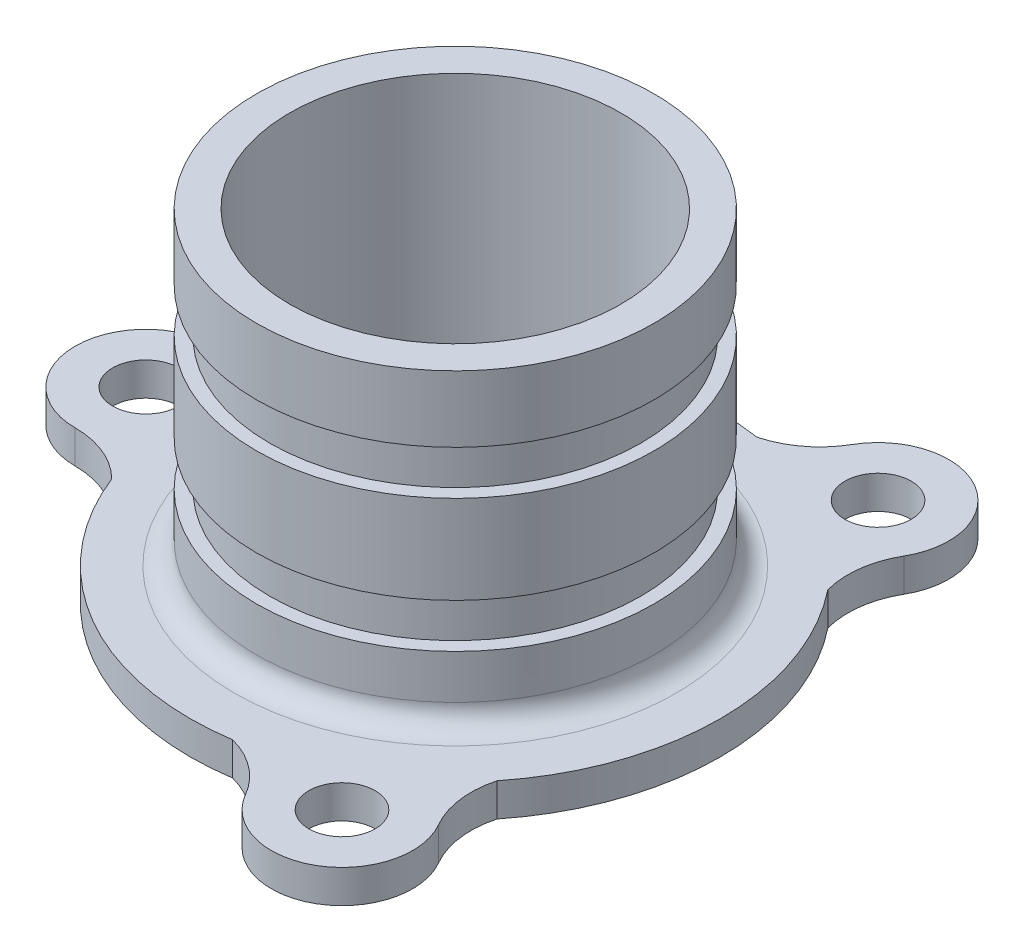
ISO-10303-21;
HEADER;
FILE_DESCRIPTION(('STEP AP214'),'2;1');
FILE_NAME('part.step','',(''),(''),'','','');
FILE_SCHEMA(('AUTOMOTIVE_DESIGN { 1 0 10303 214 1 1 1 1 }'));
ENDSEC;
DATA;
#1=APPLICATION_CONTEXT('core data for automotive mechanical design processes');
#2=APPLICATION_PROTOCOL_DEFINITION('international standard','automotive_design',2000,#1);
#3=PRODUCT_CONTEXT('',#1,'mechanical');
#4=PRODUCT('Part','Part','',(#3));
#5=PRODUCT_RELATED_PRODUCT_CATEGORY('part','',(#4));
#6=PRODUCT_DEFINITION_FORMATION('','',#4);
#7=PRODUCT_DEFINITION_CONTEXT('part definition',#1,'design');
#8=PRODUCT_DEFINITION('design','',#6,#7);
#9=PRODUCT_DEFINITION_SHAPE('','',#8);
#10=(LENGTH_UNIT() NAMED_UNIT(*) SI_UNIT(.MILLI.,.METRE.));
#11=(NAMED_UNIT(*) PLANE_ANGLE_UNIT() SI_UNIT($,.RADIAN.));
#12=(NAMED_UNIT(*) SI_UNIT($,.STERADIAN.) SOLID_ANGLE_UNIT());
#13=UNCERTAINTY_MEASURE_WITH_UNIT(LENGTH_MEASURE(1.E-05),#10,'distance_accuracy_value','');
#14=(GEOMETRIC_REPRESENTATION_CONTEXT(3) GLOBAL_UNCERTAINTY_ASSIGNED_CONTEXT((#13)) GLOBAL_UNIT_ASSIGNED_CONTEXT((#10,
#11,#12)) REPRESENTATION_CONTEXT('',''));
#15=CARTESIAN_POINT('',(0.,0.,0.));
#16=DIRECTION('',(0.,0.,1.));
#17=DIRECTION('',(1.,0.,0.));
#18=AXIS2_PLACEMENT_3D('',#15,#16,#17);
#19=CARTESIAN_POINT('',(-35.025,7.5,18.));
#20=DIRECTION('',(0.,-1.,0.));
#21=DIRECTION('',(0.,0.,-1.));
#22=AXIS2_PLACEMENT_3D('',#19,#20,#21);
#23=PLANE('',#22);
#24=CARTESIAN_POINT('',(0.,7.5,0.));
#25=DIRECTION('',(0.,-1.,0.));
#26=DIRECTION('',(0.,0.,-1.));
#27=AXIS2_PLACEMENT_3D('',#24,#25,#26);
#28=CIRCLE('',#27,50.);
#29=CARTESIAN_POINT('',(0.,7.5,-50.));
#30=VERTEX_POINT('',#29);
#31=EDGE_CURVE('E11',#30,#30,#28,.T.);
#32=ORIENTED_EDGE('',*,*,#31,.T.);
#33=EDGE_LOOP('',(#32));
#34=FACE_BOUND('',#33,.T.);
#35=CARTESIAN_POINT('',(-70.05,7.5,36.));
#36=DIRECTION('',(0.,-1.,0.));
#37=DIRECTION('',(0.,0.,-1.));
#38=AXIS2_PLACEMENT_3D('',#35,#36,#37);
#39=CIRCLE('',#38,20.);
#40=CARTESIAN_POINT('',(-70.05,7.5,16.));
#41=VERTEX_POINT('',#40);
#42=CARTESIAN_POINT('',(-55.8569276459207,7.5,21.9089852334238));
#43=VERTEX_POINT('',#42);
#44=EDGE_CURVE('E203',#41,#43,#39,.T.);
#45=ORIENTED_EDGE('',*,*,#44,.T.);
#46=CARTESIAN_POINT('',(0.,7.5,0.));
#47=DIRECTION('',(0.,1.,0.));
#48=DIRECTION('',(0.,0.,1.));
#49=AXIS2_PLACEMENT_3D('',#46,#47,#48);
#50=CIRCLE('',#49,60.);
#51=CARTESIAN_POINT('',(8.95472603967659,7.5,59.3280109354286));
#52=VERTEX_POINT('',#51);
#53=EDGE_CURVE('E115',#43,#52,#50,.T.);
#54=ORIENTED_EDGE('',*,*,#53,.T.);
#55=CARTESIAN_POINT('',(3.84808546375947,7.5,78.6650795351));
#56=DIRECTION('',(0.,-1.,0.));
#57=DIRECTION('',(0.,0.,1.));
#58=AXIS2_PLACEMENT_3D('',#55,#56,#57);
#59=CIRCLE('',#58,20.);
#60=CARTESIAN_POINT('',(21.1685935394484,7.5,68.6650795351002));
#61=VERTEX_POINT('',#60);
#62=EDGE_CURVE('E305',#52,#61,#59,.T.);
#63=ORIENTED_EDGE('',*,*,#62,.T.);
#64=CARTESIAN_POINT('',(35.0249999999994,7.5,60.6650795351003));
#65=DIRECTION('',(0.,1.,0.));
#66=DIRECTION('',(0.,0.,1.));
#67=AXIS2_PLACEMENT_3D('',#64,#65,#66);
#68=CIRCLE('',#67,16.);
#69=CARTESIAN_POINT('',(48.8814064605504,7.5,52.6650795351003));
#70=VERTEX_POINT('',#69);
#71=EDGE_CURVE('E308',#61,#70,#68,.T.);
#72=ORIENTED_EDGE('',*,*,#71,.T.);
#73=CARTESIAN_POINT('',(66.2019145362394,7.5,42.6650795351006));
#74=DIRECTION('',(0.,-1.,0.));
#75=DIRECTION('',(0.,0.,-1.));
#76=AXIS2_PLACEMENT_3D('',#73,#74,#75);
#77=CIRCLE('',#76,20.);
#78=CARTESIAN_POINT('',(46.9022016062432,7.5,37.4190257020051));
#79=VERTEX_POINT('',#78);
#80=EDGE_CURVE('E311',#70,#79,#77,.T.);
#81=ORIENTED_EDGE('',*,*,#80,.T.);
#82=CARTESIAN_POINT('',(0.,7.5,0.));
#83=DIRECTION('',(0.,1.,0.));
#84=DIRECTION('',(0.,0.,1.));
#85=AXIS2_PLACEMENT_3D('',#82,#83,#84);
#86=CIRCLE('',#85,60.);
#87=CARTESIAN_POINT('',(46.9022016062437,7.5,-37.4190257020045));
#88=VERTEX_POINT('',#87);
#89=EDGE_CURVE('E314',#79,#88,#86,.T.);
#90=ORIENTED_EDGE('',*,*,#89,.T.);
#91=CARTESIAN_POINT('',(66.20191453624,7.5,-42.6650795350996));
#92=DIRECTION('',(0.,-1.,0.));
#93=DIRECTION('',(0.,0.,1.));
#94=AXIS2_PLACEMENT_3D('',#91,#92,#93);
#95=CIRCLE('',#94,20.);
#96=CARTESIAN_POINT('',(48.8814064605513,7.5,-52.6650795350997));
#97=VERTEX_POINT('',#96);
#98=EDGE_CURVE('E317',#88,#97,#95,.T.);
#99=ORIENTED_EDGE('',*,*,#98,.T.);
#100=CARTESIAN_POINT('',(35.0250000000003,7.5,-60.6650795350998));
#101=DIRECTION('',(0.,1.,0.));
#102=DIRECTION('',(0.,0.,1.));
#103=AXIS2_PLACEMENT_3D('',#100,#101,#102);
#104=CIRCLE('',#103,16.);
#105=CARTESIAN_POINT('',(21.1685935394492,7.5,-68.6650795350997));
#106=VERTEX_POINT('',#105);
#107=EDGE_CURVE('E320',#97,#106,#104,.T.);
#108=ORIENTED_EDGE('',*,*,#107,.T.);
#109=CARTESIAN_POINT('',(3.84808546376057,7.5,-78.6650795350999));
#110=DIRECTION('',(0.,-1.,0.));
#111=DIRECTION('',(0.,0.,-1.));
#112=AXIS2_PLACEMENT_3D('',#109,#110,#111);
#113=CIRCLE('',#112,20.);
#114=CARTESIAN_POINT('',(8.95472603967744,7.5,-59.3280109354285));
#115=VERTEX_POINT('',#114);
#116=EDGE_CURVE('E146',#106,#115,#113,.T.);
#117=ORIENTED_EDGE('',*,*,#116,.T.);
#118=CARTESIAN_POINT('',(0.,7.5,0.));
#119=DIRECTION('',(0.,1.,0.));
#120=DIRECTION('',(0.,0.,1.));
#121=AXIS2_PLACEMENT_3D('',#118,#119,#120);
#122=CIRCLE('',#121,60.);
#123=CARTESIAN_POINT('',(-55.8569276459206,7.5,-21.9089852334238));
#124=VERTEX_POINT('',#123);
#125=EDGE_CURVE('E140',#115,#124,#122,.T.);
#126=ORIENTED_EDGE('',*,*,#125,.T.);
#127=CARTESIAN_POINT('',(-70.05,7.5,-36.));
#128=DIRECTION('',(0.,-1.,0.));
#129=DIRECTION('',(0.,0.,1.));
#130=AXIS2_PLACEMENT_3D('',#127,#128,#129);
#131=CIRCLE('',#130,20.);
#132=CARTESIAN_POINT('',(-70.0500000000001,7.5,-16.));
#133=VERTEX_POINT('',#132);
#134=EDGE_CURVE('E144',#124,#133,#131,.T.);
#135=ORIENTED_EDGE('',*,*,#134,.T.);
#136=CARTESIAN_POINT('',(-70.05,7.5,0.));
#137=DIRECTION('',(0.,1.,0.));
#138=DIRECTION('',(0.,0.,1.));
#139=AXIS2_PLACEMENT_3D('',#136,#137,#138);
#140=CIRCLE('',#139,16.);
#141=EDGE_CURVE('E59',#133,#41,#140,.T.);
#142=ORIENTED_EDGE('',*,*,#141,.T.);
#143=EDGE_LOOP('',(#45,#54,#63,#72,#81,#90,#99,#108,#117,#126,#135,#142));
#144=FACE_BOUND('',#143,.T.);
#145=CARTESIAN_POINT('',(-70.05,7.5,0.));
#146=DIRECTION('',(0.,1.,0.));
#147=DIRECTION('',(0.,0.,1.));
#148=AXIS2_PLACEMENT_3D('',#145,#146,#147);
#149=CIRCLE('',#148,7.50000000000001);
#150=CARTESIAN_POINT('',(-70.05,7.5,7.50000000000001));
#151=VERTEX_POINT('',#150);
#152=EDGE_CURVE('E173',#151,#151,#149,.T.);
#153=ORIENTED_EDGE('',*,*,#152,.F.);
#154=EDGE_LOOP('',(#153));
#155=FACE_BOUND('',#154,.T.);
#156=CARTESIAN_POINT('',(35.0250000000003,7.5,-60.6650795350998));
#157=DIRECTION('',(0.,1.,0.));
#158=DIRECTION('',(0.,0.,1.));
#159=AXIS2_PLACEMENT_3D('',#156,#157,#158);
#160=CIRCLE('',#159,7.50000000000001);
#161=CARTESIAN_POINT('',(35.0250000000003,7.5,-53.1650795350997));
#162=VERTEX_POINT('',#161);
#163=EDGE_CURVE('E283',#162,#162,#160,.T.);
#164=ORIENTED_EDGE('',*,*,#163,.F.);
#165=EDGE_LOOP('',(#164));
#166=FACE_BOUND('',#165,.T.);
#167=CARTESIAN_POINT('',(35.0249999999994,7.5,60.6650795351003));
#168=DIRECTION('',(0.,1.,0.));
#169=DIRECTION('',(0.,0.,1.));
#170=AXIS2_PLACEMENT_3D('',#167,#168,#169);
#171=CIRCLE('',#170,7.50000000000001);
#172=CARTESIAN_POINT('',(35.0249999999994,7.5,68.1650795351003));
#173=VERTEX_POINT('',#172);
#174=EDGE_CURVE('E275',#173,#173,#171,.T.);
#175=ORIENTED_EDGE('',*,*,#174,.F.);
#176=EDGE_LOOP('',(#175));
#177=FACE_BOUND('',#176,.T.);
#178=ADVANCED_FACE('F41',(#34,#144,#155,#166,#177),#23,.F.);
#179=CARTESIAN_POINT('',(-35.025,0.,18.));
#180=DIRECTION('',(0.,-1.,0.));
#181=DIRECTION('',(0.,0.,-1.));
#182=AXIS2_PLACEMENT_3D('',#179,#180,#181);
#183=PLANE('',#182);
#184=CARTESIAN_POINT('',(35.0250000000003,0.,-60.6650795350998));
#185=DIRECTION('',(0.,1.,0.));
#186=DIRECTION('',(0.,0.,1.));
#187=AXIS2_PLACEMENT_3D('',#184,#185,#186);
#188=CIRCLE('',#187,7.50000000000001);
#189=CARTESIAN_POINT('',(35.0250000000003,0.,-53.1650795350997));
#190=VERTEX_POINT('',#189);
#191=EDGE_CURVE('E279',#190,#190,#188,.T.);
#192=ORIENTED_EDGE('',*,*,#191,.T.);
#193=EDGE_LOOP('',(#192));
#194=FACE_BOUND('',#193,.T.);
#195=CARTESIAN_POINT('',(-70.05,0.,0.));
#196=DIRECTION('',(0.,1.,0.));
#197=DIRECTION('',(0.,0.,1.));
#198=AXIS2_PLACEMENT_3D('',#195,#196,#197);
#199=CIRCLE('',#198,7.50000000000001);
#200=CARTESIAN_POINT('',(-70.05,0.,7.50000000000001));
#201=VERTEX_POINT('',#200);
#202=EDGE_CURVE('E294',#201,#201,#199,.T.);
#203=ORIENTED_EDGE('',*,*,#202,.T.);
#204=EDGE_LOOP('',(#203));
#205=FACE_BOUND('',#204,.T.);
#206=CARTESIAN_POINT('',(-70.05,0.,36.));
#207=DIRECTION('',(0.,-1.,0.));
#208=DIRECTION('',(0.,0.,-1.));
#209=AXIS2_PLACEMENT_3D('',#206,#207,#208);
#210=CIRCLE('',#209,20.);
#211=CARTESIAN_POINT('',(-70.05,0.,16.));
#212=VERTEX_POINT('',#211);
#213=CARTESIAN_POINT('',(-55.8569276459207,0.,21.9089852334238));
#214=VERTEX_POINT('',#213);
#215=EDGE_CURVE('E168',#212,#214,#210,.T.);
#216=ORIENTED_EDGE('',*,*,#215,.F.);
#217=CARTESIAN_POINT('',(-70.05,0.,0.));
#218=DIRECTION('',(0.,1.,0.));
#219=DIRECTION('',(0.,0.,1.));
#220=AXIS2_PLACEMENT_3D('',#217,#218,#219);
#221=CIRCLE('',#220,16.);
#222=CARTESIAN_POINT('',(-70.0500000000001,0.,-16.));
#223=VERTEX_POINT('',#222);
#224=EDGE_CURVE('E106',#223,#212,#221,.T.);
#225=ORIENTED_EDGE('',*,*,#224,.F.);
#226=CARTESIAN_POINT('',(-70.05,0.,-36.));
#227=DIRECTION('',(0.,-1.,0.));
#228=DIRECTION('',(0.,0.,1.));
#229=AXIS2_PLACEMENT_3D('',#226,#227,#228);
#230=CIRCLE('',#229,20.);
#231=CARTESIAN_POINT('',(-55.8569276459206,0.,-21.9089852334238));
#232=VERTEX_POINT('',#231);
#233=EDGE_CURVE('E100',#232,#223,#230,.T.);
#234=ORIENTED_EDGE('',*,*,#233,.F.);
#235=CARTESIAN_POINT('',(0.,0.,0.));
#236=DIRECTION('',(0.,1.,0.));
#237=DIRECTION('',(0.,0.,1.));
#238=AXIS2_PLACEMENT_3D('',#235,#236,#237);
#239=CIRCLE('',#238,60.);
#240=CARTESIAN_POINT('',(8.95472603967744,0.,-59.3280109354285));
#241=VERTEX_POINT('',#240);
#242=EDGE_CURVE('E155',#241,#232,#239,.T.);
#243=ORIENTED_EDGE('',*,*,#242,.F.);
#244=CARTESIAN_POINT('',(3.84808546376057,0.,-78.6650795350999));
#245=DIRECTION('',(0.,-1.,0.));
#246=DIRECTION('',(0.,0.,-1.));
#247=AXIS2_PLACEMENT_3D('',#244,#245,#246);
#248=CIRCLE('',#247,20.);
#249=CARTESIAN_POINT('',(21.1685935394492,0.,-68.6650795350997));
#250=VERTEX_POINT('',#249);
#251=EDGE_CURVE('E194',#250,#241,#248,.T.);
#252=ORIENTED_EDGE('',*,*,#251,.F.);
#253=CARTESIAN_POINT('',(35.0250000000003,0.,-60.6650795350998));
#254=DIRECTION('',(0.,1.,0.));
#255=DIRECTION('',(0.,0.,1.));
#256=AXIS2_PLACEMENT_3D('',#253,#254,#255);
#257=CIRCLE('',#256,16.);
#258=CARTESIAN_POINT('',(48.8814064605513,0.,-52.6650795350997));
#259=VERTEX_POINT('',#258);
#260=EDGE_CURVE('E191',#259,#250,#257,.T.);
#261=ORIENTED_EDGE('',*,*,#260,.F.);
#262=CARTESIAN_POINT('',(66.20191453624,0.,-42.6650795350996));
#263=DIRECTION('',(0.,-1.,0.));
#264=DIRECTION('',(0.,0.,1.));
#265=AXIS2_PLACEMENT_3D('',#262,#263,#264);
#266=CIRCLE('',#265,20.);
#267=CARTESIAN_POINT('',(46.9022016062437,0.,-37.4190257020045));
#268=VERTEX_POINT('',#267);
#269=EDGE_CURVE('E188',#268,#259,#266,.T.);
#270=ORIENTED_EDGE('',*,*,#269,.F.);
#271=CARTESIAN_POINT('',(0.,0.,0.));
#272=DIRECTION('',(0.,1.,0.));
#273=DIRECTION('',(0.,0.,1.));
#274=AXIS2_PLACEMENT_3D('',#271,#272,#273);
#275=CIRCLE('',#274,60.);
#276=CARTESIAN_POINT('',(46.9022016062432,0.,37.4190257020051));
#277=VERTEX_POINT('',#276);
#278=EDGE_CURVE('E185',#277,#268,#275,.T.);
#279=ORIENTED_EDGE('',*,*,#278,.F.);
#280=CARTESIAN_POINT('',(66.2019145362394,0.,42.6650795351006));
#281=DIRECTION('',(0.,-1.,0.));
#282=DIRECTION('',(0.,0.,-1.));
#283=AXIS2_PLACEMENT_3D('',#280,#281,#282);
#284=CIRCLE('',#283,20.);
#285=CARTESIAN_POINT('',(48.8814064605504,0.,52.6650795351003));
#286=VERTEX_POINT('',#285);
#287=EDGE_CURVE('E182',#286,#277,#284,.T.);
#288=ORIENTED_EDGE('',*,*,#287,.F.);
#289=CARTESIAN_POINT('',(35.0249999999994,0.,60.6650795351003));
#290=DIRECTION('',(0.,1.,0.));
#291=DIRECTION('',(0.,0.,1.));
#292=AXIS2_PLACEMENT_3D('',#289,#290,#291);
#293=CIRCLE('',#292,16.);
#294=CARTESIAN_POINT('',(21.1685935394484,0.,68.6650795351002));
#295=VERTEX_POINT('',#294);
#296=EDGE_CURVE('E179',#295,#286,#293,.T.);
#297=ORIENTED_EDGE('',*,*,#296,.F.);
#298=CARTESIAN_POINT('',(3.84808546375947,0.,78.6650795351));
#299=DIRECTION('',(0.,-1.,0.));
#300=DIRECTION('',(0.,0.,1.));
#301=AXIS2_PLACEMENT_3D('',#298,#299,#300);
#302=CIRCLE('',#301,20.);
#303=CARTESIAN_POINT('',(8.95472603967659,0.,59.3280109354286));
#304=VERTEX_POINT('',#303);
#305=EDGE_CURVE('E176',#304,#295,#302,.T.);
#306=ORIENTED_EDGE('',*,*,#305,.F.);
#307=CARTESIAN_POINT('',(0.,0.,0.));
#308=DIRECTION('',(0.,1.,0.));
#309=DIRECTION('',(0.,0.,1.));
#310=AXIS2_PLACEMENT_3D('',#307,#308,#309);
#311=CIRCLE('',#310,60.);
#312=EDGE_CURVE('E172',#214,#304,#311,.T.);
#313=ORIENTED_EDGE('',*,*,#312,.F.);
#314=EDGE_LOOP('',(#216,#225,#234,#243,#252,#261,#270,#279,#288,#297,#306,#313));
#315=FACE_BOUND('',#314,.T.);
#316=CARTESIAN_POINT('',(0.,0.,0.));
#317=DIRECTION('',(0.,1.,0.));
#318=DIRECTION('',(0.,0.,1.));
#319=AXIS2_PLACEMENT_3D('',#316,#317,#318);
#320=CIRCLE('',#319,37.5);
#321=CARTESIAN_POINT('',(0.,0.,37.5));
#322=VERTEX_POINT('',#321);
#323=EDGE_CURVE('E287',#322,#322,#320,.T.);
#324=ORIENTED_EDGE('',*,*,#323,.T.);
#325=EDGE_LOOP('',(#324));
#326=FACE_BOUND('',#325,.T.);
#327=CARTESIAN_POINT('',(35.0249999999994,0.,60.6650795351003));
#328=DIRECTION('',(0.,1.,0.));
#329=DIRECTION('',(0.,0.,1.));
#330=AXIS2_PLACEMENT_3D('',#327,#328,#329);
#331=CIRCLE('',#330,7.50000000000001);
#332=CARTESIAN_POINT('',(35.0249999999994,0.,68.1650795351003));
#333=VERTEX_POINT('',#332);
#334=EDGE_CURVE('E274',#333,#333,#331,.T.);
#335=ORIENTED_EDGE('',*,*,#334,.T.);
#336=EDGE_LOOP('',(#335));
#337=FACE_BOUND('',#336,.T.);
#338=ADVANCED_FACE('F357',(#194,#205,#315,#326,#337),#183,.T.);
#339=CARTESIAN_POINT('',(-70.05,7.5,36.));
#340=DIRECTION('',(0.,-1.,0.));
#341=DIRECTION('',(0.,0.,-1.));
#342=AXIS2_PLACEMENT_3D('',#339,#340,#341);
#343=CYLINDRICAL_SURFACE('',#342,20.);
#344=ORIENTED_EDGE('',*,*,#215,.T.);
#345=DIRECTION('',(0.,-1.,0.));
#346=VECTOR('',#345,1.);
#347=CARTESIAN_POINT('',(-55.8569276459207,7.5,21.9089852334238));
#348=LINE('',#347,#346);
#349=EDGE_CURVE('E238',#43,#214,#348,.T.);
#350=ORIENTED_EDGE('',*,*,#349,.F.);
#351=ORIENTED_EDGE('',*,*,#44,.F.);
#352=DIRECTION('',(0.,-1.,0.));
#353=VECTOR('',#352,1.);
#354=CARTESIAN_POINT('',(-70.05,7.5,16.));
#355=LINE('',#354,#353);
#356=EDGE_CURVE('E164',#41,#212,#355,.T.);
#357=ORIENTED_EDGE('',*,*,#356,.T.);
#358=EDGE_LOOP('',(#344,#350,#351,#357));
#359=FACE_BOUND('',#358,.T.);
#360=ADVANCED_FACE('F363',(#359),#343,.F.);
#361=CARTESIAN_POINT('',(0.,7.5,0.));
#362=DIRECTION('',(0.,-1.,0.));
#363=DIRECTION('',(0.,0.,-1.));
#364=AXIS2_PLACEMENT_3D('',#361,#362,#363);
#365=CYLINDRICAL_SURFACE('',#364,60.);
#366=ORIENTED_EDGE('',*,*,#312,.T.);
#367=DIRECTION('',(0.,-1.,0.));
#368=VECTOR('',#367,1.);
#369=CARTESIAN_POINT('',(8.95472603967659,7.5,59.3280109354286));
#370=LINE('',#369,#368);
#371=EDGE_CURVE('E234',#52,#304,#370,.T.);
#372=ORIENTED_EDGE('',*,*,#371,.F.);
#373=ORIENTED_EDGE('',*,*,#53,.F.);
#374=ORIENTED_EDGE('',*,*,#349,.T.);
#375=EDGE_LOOP('',(#366,#372,#373,#374));
#376=FACE_BOUND('',#375,.T.);
#377=ADVANCED_FACE('F404',(#376),#365,.T.);
#378=CARTESIAN_POINT('',(3.84808546375947,7.5,78.6650795351));
#379=DIRECTION('',(0.,-1.,0.));
#380=DIRECTION('',(0.,0.,-1.));
#381=AXIS2_PLACEMENT_3D('',#378,#379,#380);
#382=CYLINDRICAL_SURFACE('',#381,20.);
#383=ORIENTED_EDGE('',*,*,#305,.T.);
#384=DIRECTION('',(0.,-1.,0.));
#385=VECTOR('',#384,1.);
#386=CARTESIAN_POINT('',(21.1685935394484,7.5,68.6650795351002));
#387=LINE('',#386,#385);
#388=EDGE_CURVE('E230',#61,#295,#387,.T.);
#389=ORIENTED_EDGE('',*,*,#388,.F.);
#390=ORIENTED_EDGE('',*,*,#62,.F.);
#391=ORIENTED_EDGE('',*,*,#371,.T.);
#392=EDGE_LOOP('',(#383,#389,#390,#391));
#393=FACE_BOUND('',#392,.T.);
#394=ADVANCED_FACE('F400',(#393),#382,.F.);
#395=CARTESIAN_POINT('',(35.0249999999994,7.5,60.6650795351003));
#396=DIRECTION('',(0.,-1.,0.));
#397=DIRECTION('',(0.,0.,-1.));
#398=AXIS2_PLACEMENT_3D('',#395,#396,#397);
#399=CYLINDRICAL_SURFACE('',#398,16.);
#400=ORIENTED_EDGE('',*,*,#296,.T.);
#401=DIRECTION('',(0.,-1.,0.));
#402=VECTOR('',#401,1.);
#403=CARTESIAN_POINT('',(48.8814064605504,7.5,52.6650795351003));
#404=LINE('',#403,#402);
#405=EDGE_CURVE('E226',#70,#286,#404,.T.);
#406=ORIENTED_EDGE('',*,*,#405,.F.);
#407=ORIENTED_EDGE('',*,*,#71,.F.);
#408=ORIENTED_EDGE('',*,*,#388,.T.);
#409=EDGE_LOOP('',(#400,#406,#407,#408));
#410=FACE_BOUND('',#409,.T.);
#411=ADVANCED_FACE('F396',(#410),#399,.T.);
#412=CARTESIAN_POINT('',(66.2019145362394,7.5,42.6650795351006));
#413=DIRECTION('',(0.,-1.,0.));
#414=DIRECTION('',(0.,0.,-1.));
#415=AXIS2_PLACEMENT_3D('',#412,#413,#414);
#416=CYLINDRICAL_SURFACE('',#415,20.);
#417=ORIENTED_EDGE('',*,*,#287,.T.);
#418=DIRECTION('',(0.,-1.,0.));
#419=VECTOR('',#418,1.);
#420=CARTESIAN_POINT('',(46.9022016062432,7.5,37.4190257020051));
#421=LINE('',#420,#419);
#422=EDGE_CURVE('E222',#79,#277,#421,.T.);
#423=ORIENTED_EDGE('',*,*,#422,.F.);
#424=ORIENTED_EDGE('',*,*,#80,.F.);
#425=ORIENTED_EDGE('',*,*,#405,.T.);
#426=EDGE_LOOP('',(#417,#423,#424,#425));
#427=FACE_BOUND('',#426,.T.);
#428=ADVANCED_FACE('F392',(#427),#416,.F.);
#429=CARTESIAN_POINT('',(0.,7.5,0.));
#430=DIRECTION('',(0.,-1.,0.));
#431=DIRECTION('',(0.,0.,-1.));
#432=AXIS2_PLACEMENT_3D('',#429,#430,#431);
#433=CYLINDRICAL_SURFACE('',#432,60.);
#434=ORIENTED_EDGE('',*,*,#278,.T.);
#435=DIRECTION('',(0.,-1.,0.));
#436=VECTOR('',#435,1.);
#437=CARTESIAN_POINT('',(46.9022016062437,7.5,-37.4190257020045));
#438=LINE('',#437,#436);
#439=EDGE_CURVE('E218',#88,#268,#438,.T.);
#440=ORIENTED_EDGE('',*,*,#439,.F.);
#441=ORIENTED_EDGE('',*,*,#89,.F.);
#442=ORIENTED_EDGE('',*,*,#422,.T.);
#443=EDGE_LOOP('',(#434,#440,#441,#442));
#444=FACE_BOUND('',#443,.T.);
#445=ADVANCED_FACE('F388',(#444),#433,.T.);
#446=CARTESIAN_POINT('',(66.20191453624,7.5,-42.6650795350996));
#447=DIRECTION('',(0.,-1.,0.));
#448=DIRECTION('',(0.,0.,-1.));
#449=AXIS2_PLACEMENT_3D('',#446,#447,#448);
#450=CYLINDRICAL_SURFACE('',#449,20.);
#451=ORIENTED_EDGE('',*,*,#269,.T.);
#452=DIRECTION('',(0.,-1.,0.));
#453=VECTOR('',#452,1.);
#454=CARTESIAN_POINT('',(48.8814064605513,7.5,-52.6650795350997));
#455=LINE('',#454,#453);
#456=EDGE_CURVE('E214',#97,#259,#455,.T.);
#457=ORIENTED_EDGE('',*,*,#456,.F.);
#458=ORIENTED_EDGE('',*,*,#98,.F.);
#459=ORIENTED_EDGE('',*,*,#439,.T.);
#460=EDGE_LOOP('',(#451,#457,#458,#459));
#461=FACE_BOUND('',#460,.T.);
#462=ADVANCED_FACE('F384',(#461),#450,.F.);
#463=CARTESIAN_POINT('',(35.0250000000003,7.5,-60.6650795350998));
#464=DIRECTION('',(0.,-1.,0.));
#465=DIRECTION('',(0.,0.,-1.));
#466=AXIS2_PLACEMENT_3D('',#463,#464,#465);
#467=CYLINDRICAL_SURFACE('',#466,16.);
#468=ORIENTED_EDGE('',*,*,#260,.T.);
#469=DIRECTION('',(0.,-1.,0.));
#470=VECTOR('',#469,1.);
#471=CARTESIAN_POINT('',(21.1685935394492,7.5,-68.6650795350997));
#472=LINE('',#471,#470);
#473=EDGE_CURVE('E210',#106,#250,#472,.T.);
#474=ORIENTED_EDGE('',*,*,#473,.F.);
#475=ORIENTED_EDGE('',*,*,#107,.F.);
#476=ORIENTED_EDGE('',*,*,#456,.T.);
#477=EDGE_LOOP('',(#468,#474,#475,#476));
#478=FACE_BOUND('',#477,.T.);
#479=ADVANCED_FACE('F380',(#478),#467,.T.);
#480=CARTESIAN_POINT('',(3.84808546376057,7.5,-78.6650795350999));
#481=DIRECTION('',(0.,-1.,0.));
#482=DIRECTION('',(0.,0.,-1.));
#483=AXIS2_PLACEMENT_3D('',#480,#481,#482);
#484=CYLINDRICAL_SURFACE('',#483,20.);
#485=ORIENTED_EDGE('',*,*,#251,.T.);
#486=DIRECTION('',(0.,-1.,0.));
#487=VECTOR('',#486,1.);
#488=CARTESIAN_POINT('',(8.95472603967744,7.5,-59.3280109354285));
#489=LINE('',#488,#487);
#490=EDGE_CURVE('E157',#115,#241,#489,.T.);
#491=ORIENTED_EDGE('',*,*,#490,.F.);
#492=ORIENTED_EDGE('',*,*,#116,.F.);
#493=ORIENTED_EDGE('',*,*,#473,.T.);
#494=EDGE_LOOP('',(#485,#491,#492,#493));
#495=FACE_BOUND('',#494,.T.);
#496=ADVANCED_FACE('F377',(#495),#484,.F.);
#497=CARTESIAN_POINT('',(0.,7.5,0.));
#498=DIRECTION('',(0.,-1.,0.));
#499=DIRECTION('',(0.,0.,-1.));
#500=AXIS2_PLACEMENT_3D('',#497,#498,#499);
#501=CYLINDRICAL_SURFACE('',#500,60.);
#502=ORIENTED_EDGE('',*,*,#242,.T.);
#503=DIRECTION('',(0.,-1.,0.));
#504=VECTOR('',#503,1.);
#505=CARTESIAN_POINT('',(-55.8569276459206,7.5,-21.9089852334238));
#506=LINE('',#505,#504);
#507=EDGE_CURVE('E152',#124,#232,#506,.T.);
#508=ORIENTED_EDGE('',*,*,#507,.F.);
#509=ORIENTED_EDGE('',*,*,#125,.F.);
#510=ORIENTED_EDGE('',*,*,#490,.T.);
#511=EDGE_LOOP('',(#502,#508,#509,#510));
#512=FACE_BOUND('',#511,.T.);
#513=ADVANCED_FACE('F153',(#512),#501,.T.);
#514=CARTESIAN_POINT('',(-70.05,7.5,-36.));
#515=DIRECTION('',(0.,-1.,0.));
#516=DIRECTION('',(0.,0.,-1.));
#517=AXIS2_PLACEMENT_3D('',#514,#515,#516);
#518=CYLINDRICAL_SURFACE('',#517,20.);
#519=ORIENTED_EDGE('',*,*,#233,.T.);
#520=DIRECTION('',(0.,-1.,0.));
#521=VECTOR('',#520,1.);
#522=CARTESIAN_POINT('',(-70.0500000000001,7.5,-16.));
#523=LINE('',#522,#521);
#524=EDGE_CURVE('E158',#133,#223,#523,.T.);
#525=ORIENTED_EDGE('',*,*,#524,.F.);
#526=ORIENTED_EDGE('',*,*,#134,.F.);
#527=ORIENTED_EDGE('',*,*,#507,.T.);
#528=EDGE_LOOP('',(#519,#525,#526,#527));
#529=FACE_BOUND('',#528,.T.);
#530=ADVANCED_FACE('F160',(#529),#518,.F.);
#531=CARTESIAN_POINT('',(-70.05,7.5,0.));
#532=DIRECTION('',(0.,-1.,0.));
#533=DIRECTION('',(0.,0.,-1.));
#534=AXIS2_PLACEMENT_3D('',#531,#532,#533);
#535=CYLINDRICAL_SURFACE('',#534,16.);
#536=ORIENTED_EDGE('',*,*,#224,.T.);
#537=ORIENTED_EDGE('',*,*,#356,.F.);
#538=ORIENTED_EDGE('',*,*,#141,.F.);
#539=ORIENTED_EDGE('',*,*,#524,.T.);
#540=EDGE_LOOP('',(#536,#537,#538,#539));
#541=FACE_BOUND('',#540,.T.);
#542=ADVANCED_FACE('F370',(#541),#535,.T.);
#543=CARTESIAN_POINT('',(-70.05,7.5,0.));
#544=DIRECTION('',(0.,-1.,0.));
#545=DIRECTION('',(0.,0.,-1.));
#546=AXIS2_PLACEMENT_3D('',#543,#544,#545);
#547=CYLINDRICAL_SURFACE('',#546,7.50000000000001);
#548=ORIENTED_EDGE('',*,*,#152,.T.);
#549=EDGE_LOOP('',(#548));
#550=FACE_BOUND('',#549,.T.);
#551=ORIENTED_EDGE('',*,*,#202,.F.);
#552=EDGE_LOOP('',(#551));
#553=FACE_BOUND('',#552,.T.);
#554=ADVANCED_FACE('F367',(#550,#553),#547,.F.);
#555=CARTESIAN_POINT('',(0.,7.5,0.));
#556=DIRECTION('',(0.,-1.,0.));
#557=DIRECTION('',(0.,0.,-1.));
#558=AXIS2_PLACEMENT_3D('',#555,#556,#557);
#559=CYLINDRICAL_SURFACE('',#558,37.5);
#560=ORIENTED_EDGE('',*,*,#323,.F.);
#561=EDGE_LOOP('',(#560));
#562=FACE_BOUND('',#561,.T.);
#563=CARTESIAN_POINT('',(0.,77.5,0.));
#564=DIRECTION('',(0.,1.,0.));
#565=DIRECTION('',(0.,0.,1.));
#566=AXIS2_PLACEMENT_3D('',#563,#564,#565);
#567=CIRCLE('',#566,37.5);
#568=CARTESIAN_POINT('',(0.,77.5,37.5));
#569=VERTEX_POINT('',#568);
#570=EDGE_CURVE('E333',#569,#569,#567,.T.);
#571=ORIENTED_EDGE('',*,*,#570,.T.);
#572=EDGE_LOOP('',(#571));
#573=FACE_BOUND('',#572,.T.);
#574=ADVANCED_FACE('F338',(#562,#573),#559,.F.);
#575=CARTESIAN_POINT('',(35.0250000000003,7.5,-60.6650795350998));
#576=DIRECTION('',(0.,-1.,0.));
#577=DIRECTION('',(0.,0.,-1.));
#578=AXIS2_PLACEMENT_3D('',#575,#576,#577);
#579=CYLINDRICAL_SURFACE('',#578,7.50000000000001);
#580=ORIENTED_EDGE('',*,*,#163,.T.);
#581=EDGE_LOOP('',(#580));
#582=FACE_BOUND('',#581,.T.);
#583=ORIENTED_EDGE('',*,*,#191,.F.);
#584=EDGE_LOOP('',(#583));
#585=FACE_BOUND('',#584,.T.);
#586=ADVANCED_FACE('F442',(#582,#585),#579,.F.);
#587=CARTESIAN_POINT('',(35.0249999999994,7.5,60.6650795351003));
#588=DIRECTION('',(0.,-1.,0.));
#589=DIRECTION('',(0.,0.,-1.));
#590=AXIS2_PLACEMENT_3D('',#587,#588,#589);
#591=CYLINDRICAL_SURFACE('',#590,7.50000000000001);
#592=ORIENTED_EDGE('',*,*,#174,.T.);
#593=EDGE_LOOP('',(#592));
#594=FACE_BOUND('',#593,.T.);
#595=ORIENTED_EDGE('',*,*,#334,.F.);
#596=EDGE_LOOP('',(#595));
#597=FACE_BOUND('',#596,.T.);
#598=ADVANCED_FACE('F439',(#594,#597),#591,.F.);
#599=CARTESIAN_POINT('',(0.,22.5,0.));
#600=DIRECTION('',(0.,-1.,0.));
#601=DIRECTION('',(0.,0.,-1.));
#602=AXIS2_PLACEMENT_3D('',#599,#600,#601);
#603=CYLINDRICAL_SURFACE('',#602,45.);
#604=CARTESIAN_POINT('',(0.,12.5,0.));
#605=DIRECTION('',(0.,-1.,0.));
#606=DIRECTION('',(0.,0.,-1.));
#607=AXIS2_PLACEMENT_3D('',#604,#605,#606);
#608=CIRCLE('',#607,45.);
#609=CARTESIAN_POINT('',(0.,12.5,-45.));
#610=VERTEX_POINT('',#609);
#611=EDGE_CURVE('E51',#610,#610,#608,.F.);
#612=ORIENTED_EDGE('',*,*,#611,.T.);
#613=EDGE_LOOP('',(#612));
#614=FACE_BOUND('',#613,.T.);
#615=CARTESIAN_POINT('',(0.,22.5,0.));
#616=DIRECTION('',(0.,1.,0.));
#617=DIRECTION('',(0.,0.,1.));
#618=AXIS2_PLACEMENT_3D('',#615,#616,#617);
#619=CIRCLE('',#618,45.);
#620=CARTESIAN_POINT('',(0.,22.5,45.));
#621=VERTEX_POINT('',#620);
#622=EDGE_CURVE('E269',#621,#621,#619,.T.);
#623=ORIENTED_EDGE('',*,*,#622,.F.);
#624=EDGE_LOOP('',(#623));
#625=FACE_BOUND('',#624,.T.);
#626=ADVANCED_FACE('F441',(#614,#625),#603,.T.);
#627=CARTESIAN_POINT('',(0.,22.5,0.));
#628=DIRECTION('',(0.,1.,0.));
#629=DIRECTION('',(0.,0.,1.));
#630=AXIS2_PLACEMENT_3D('',#627,#628,#629);
#631=PLANE('',#630);
#632=CARTESIAN_POINT('',(0.,22.5,0.));
#633=DIRECTION('',(0.,1.,0.));
#634=DIRECTION('',(0.,0.,1.));
#635=AXIS2_PLACEMENT_3D('',#632,#633,#634);
#636=CIRCLE('',#635,42.);
#637=CARTESIAN_POINT('',(0.,22.5,42.));
#638=VERTEX_POINT('',#637);
#639=EDGE_CURVE('E240',#638,#638,#636,.T.);
#640=ORIENTED_EDGE('',*,*,#639,.F.);
#641=EDGE_LOOP('',(#640));
#642=FACE_BOUND('',#641,.T.);
#643=ORIENTED_EDGE('',*,*,#622,.T.);
#644=EDGE_LOOP('',(#643));
#645=FACE_BOUND('',#644,.T.);
#646=ADVANCED_FACE('F449',(#642,#645),#631,.T.);
#647=CARTESIAN_POINT('',(0.,32.5,0.));
#648=DIRECTION('',(0.,-1.,0.));
#649=DIRECTION('',(0.,0.,-1.));
#650=AXIS2_PLACEMENT_3D('',#647,#648,#649);
#651=CYLINDRICAL_SURFACE('',#650,42.);
#652=CARTESIAN_POINT('',(0.,32.5,0.));
#653=DIRECTION('',(0.,1.,0.));
#654=DIRECTION('',(0.,0.,1.));
#655=AXIS2_PLACEMENT_3D('',#652,#653,#654);
#656=CIRCLE('',#655,42.);
#657=CARTESIAN_POINT('',(0.,32.5,42.));
#658=VERTEX_POINT('',#657);
#659=EDGE_CURVE('E262',#658,#658,#656,.T.);
#660=ORIENTED_EDGE('',*,*,#659,.F.);
#661=EDGE_LOOP('',(#660));
#662=FACE_BOUND('',#661,.T.);
#663=ORIENTED_EDGE('',*,*,#639,.T.);
#664=EDGE_LOOP('',(#663));
#665=FACE_BOUND('',#664,.T.);
#666=ADVANCED_FACE('F607',(#662,#665),#651,.T.);
#667=CARTESIAN_POINT('',(0.,52.5,0.));
#668=DIRECTION('',(0.,-1.,0.));
#669=DIRECTION('',(0.,0.,-1.));
#670=AXIS2_PLACEMENT_3D('',#667,#668,#669);
#671=CYLINDRICAL_SURFACE('',#670,45.);
#672=CARTESIAN_POINT('',(0.,52.5,0.));
#673=DIRECTION('',(0.,1.,0.));
#674=DIRECTION('',(0.,0.,1.));
#675=AXIS2_PLACEMENT_3D('',#672,#673,#674);
#676=CIRCLE('',#675,45.);
#677=CARTESIAN_POINT('',(0.,52.5,45.));
#678=VERTEX_POINT('',#677);
#679=EDGE_CURVE('E258',#678,#678,#676,.T.);
#680=ORIENTED_EDGE('',*,*,#679,.F.);
#681=EDGE_LOOP('',(#680));
#682=FACE_BOUND('',#681,.T.);
#683=CARTESIAN_POINT('',(0.,32.5,0.));
#684=DIRECTION('',(0.,1.,0.));
#685=DIRECTION('',(0.,0.,1.));
#686=AXIS2_PLACEMENT_3D('',#683,#684,#685);
#687=CIRCLE('',#686,45.);
#688=CARTESIAN_POINT('',(0.,32.5,45.));
#689=VERTEX_POINT('',#688);
#690=EDGE_CURVE('E263',#689,#689,#687,.T.);
#691=ORIENTED_EDGE('',*,*,#690,.T.);
#692=EDGE_LOOP('',(#691));
#693=FACE_BOUND('',#692,.T.);
#694=ADVANCED_FACE('F587',(#682,#693),#671,.T.);
#695=CARTESIAN_POINT('',(0.,52.5,0.));
#696=DIRECTION('',(0.,1.,0.));
#697=DIRECTION('',(0.,0.,1.));
#698=AXIS2_PLACEMENT_3D('',#695,#696,#697);
#699=PLANE('',#698);
#700=CARTESIAN_POINT('',(0.,52.5,0.));
#701=DIRECTION('',(0.,1.,0.));
#702=DIRECTION('',(0.,0.,1.));
#703=AXIS2_PLACEMENT_3D('',#700,#701,#702);
#704=CIRCLE('',#703,42.);
#705=CARTESIAN_POINT('',(0.,52.5,42.));
#706=VERTEX_POINT('',#705);
#707=EDGE_CURVE('E243',#706,#706,#704,.T.);
#708=ORIENTED_EDGE('',*,*,#707,.F.);
#709=EDGE_LOOP('',(#708));
#710=FACE_BOUND('',#709,.T.);
#711=ORIENTED_EDGE('',*,*,#679,.T.);
#712=EDGE_LOOP('',(#711));
#713=FACE_BOUND('',#712,.T.);
#714=ADVANCED_FACE('F582',(#710,#713),#699,.T.);
#715=CARTESIAN_POINT('',(0.,32.5,0.));
#716=DIRECTION('',(0.,1.,0.));
#717=DIRECTION('',(0.,0.,1.));
#718=AXIS2_PLACEMENT_3D('',#715,#716,#717);
#719=PLANE('',#718);
#720=ORIENTED_EDGE('',*,*,#659,.T.);
#721=EDGE_LOOP('',(#720));
#722=FACE_BOUND('',#721,.T.);
#723=ORIENTED_EDGE('',*,*,#690,.F.);
#724=EDGE_LOOP('',(#723));
#725=FACE_BOUND('',#724,.T.);
#726=ADVANCED_FACE('F353',(#722,#725),#719,.F.);
#727=CARTESIAN_POINT('',(0.,62.5,0.));
#728=DIRECTION('',(0.,-1.,0.));
#729=DIRECTION('',(0.,0.,-1.));
#730=AXIS2_PLACEMENT_3D('',#727,#728,#729);
#731=CYLINDRICAL_SURFACE('',#730,42.);
#732=CARTESIAN_POINT('',(0.,62.5,0.));
#733=DIRECTION('',(0.,1.,0.));
#734=DIRECTION('',(0.,0.,1.));
#735=AXIS2_PLACEMENT_3D('',#732,#733,#734);
#736=CIRCLE('',#735,42.);
#737=CARTESIAN_POINT('',(0.,62.5,42.));
#738=VERTEX_POINT('',#737);
#739=EDGE_CURVE('E256',#738,#738,#736,.T.);
#740=ORIENTED_EDGE('',*,*,#739,.F.);
#741=EDGE_LOOP('',(#740));
#742=FACE_BOUND('',#741,.T.);
#743=ORIENTED_EDGE('',*,*,#707,.T.);
#744=EDGE_LOOP('',(#743));
#745=FACE_BOUND('',#744,.T.);
#746=ADVANCED_FACE('F343',(#742,#745),#731,.T.);
#747=CARTESIAN_POINT('',(0.,77.5,0.));
#748=DIRECTION('',(0.,1.,0.));
#749=DIRECTION('',(0.,0.,1.));
#750=AXIS2_PLACEMENT_3D('',#747,#748,#749);
#751=PLANE('',#750);
#752=CARTESIAN_POINT('',(0.,77.5,0.));
#753=DIRECTION('',(0.,1.,0.));
#754=DIRECTION('',(0.,0.,1.));
#755=AXIS2_PLACEMENT_3D('',#752,#753,#754);
#756=CIRCLE('',#755,45.);
#757=CARTESIAN_POINT('',(0.,77.5,45.));
#758=VERTEX_POINT('',#757);
#759=EDGE_CURVE('E326',#758,#758,#756,.T.);
#760=ORIENTED_EDGE('',*,*,#759,.T.);
#761=EDGE_LOOP('',(#760));
#762=FACE_BOUND('',#761,.T.);
#763=ORIENTED_EDGE('',*,*,#570,.F.);
#764=EDGE_LOOP('',(#763));
#765=FACE_BOUND('',#764,.T.);
#766=ADVANCED_FACE('F340',(#762,#765),#751,.T.);
#767=CARTESIAN_POINT('',(0.,62.5,0.));
#768=DIRECTION('',(0.,1.,0.));
#769=DIRECTION('',(0.,0.,1.));
#770=AXIS2_PLACEMENT_3D('',#767,#768,#769);
#771=PLANE('',#770);
#772=ORIENTED_EDGE('',*,*,#739,.T.);
#773=EDGE_LOOP('',(#772));
#774=FACE_BOUND('',#773,.T.);
#775=CARTESIAN_POINT('',(0.,62.5,0.));
#776=DIRECTION('',(0.,1.,0.));
#777=DIRECTION('',(0.,0.,1.));
#778=AXIS2_PLACEMENT_3D('',#775,#776,#777);
#779=CIRCLE('',#778,45.);
#780=CARTESIAN_POINT('',(0.,62.5,45.));
#781=VERTEX_POINT('',#780);
#782=EDGE_CURVE('E329',#781,#781,#779,.T.);
#783=ORIENTED_EDGE('',*,*,#782,.F.);
#784=EDGE_LOOP('',(#783));
#785=FACE_BOUND('',#784,.T.);
#786=ADVANCED_FACE('F342',(#774,#785),#771,.F.);
#787=CARTESIAN_POINT('',(0.,77.5,0.));
#788=DIRECTION('',(0.,-1.,0.));
#789=DIRECTION('',(0.,0.,-1.));
#790=AXIS2_PLACEMENT_3D('',#787,#788,#789);
#791=CYLINDRICAL_SURFACE('',#790,45.);
#792=ORIENTED_EDGE('',*,*,#759,.F.);
#793=EDGE_LOOP('',(#792));
#794=FACE_BOUND('',#793,.T.);
#795=ORIENTED_EDGE('',*,*,#782,.T.);
#796=EDGE_LOOP('',(#795));
#797=FACE_BOUND('',#796,.T.);
#798=ADVANCED_FACE('F350',(#794,#797),#791,.T.);
#799=CARTESIAN_POINT('',(0.,12.5,0.));
#800=DIRECTION('',(0.,-1.,0.));
#801=DIRECTION('',(0.,0.,-1.));
#802=AXIS2_PLACEMENT_3D('',#799,#800,#801);
#803=TOROIDAL_SURFACE('',#802,50.,5.);
#804=ORIENTED_EDGE('',*,*,#31,.F.);
#805=EDGE_LOOP('',(#804));
#806=FACE_BOUND('',#805,.T.);
#807=ORIENTED_EDGE('',*,*,#611,.F.);
#808=EDGE_LOOP('',(#807));
#809=FACE_BOUND('',#808,.T.);
#810=ADVANCED_FACE('F43',(#806,#809),#803,.F.);
#811=CLOSED_SHELL('',(#178,#338,#360,#377,#394,#411,#428,#445,#462,#479,#496,#513,#530,#542,
#554,#574,#586,#598,#626,#646,#666,#694,#714,#726,#746,#766,#786,#798,#810));
#812=MANIFOLD_SOLID_BREP('B2',#811);
#813=ADVANCED_BREP_SHAPE_REPRESENTATION('',(#18,#812),#14);
#814=SHAPE_DEFINITION_REPRESENTATION(#9,#813);
ENDSEC;
END-ISO-10303-21;
